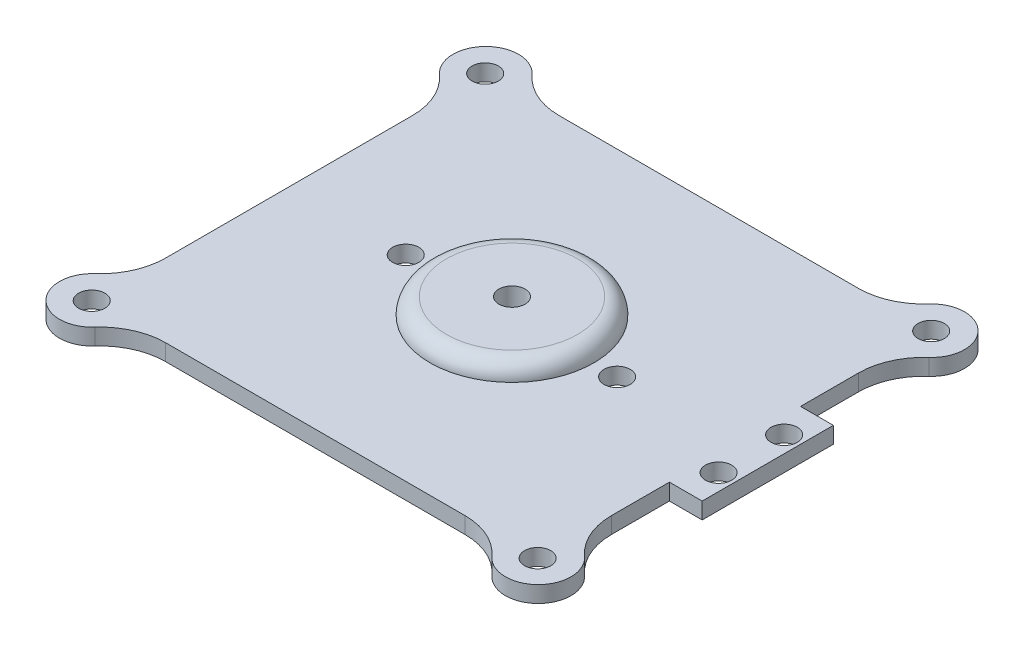
ISO-10303-21;
HEADER;
FILE_DESCRIPTION(('STEP AP214'),'2;1');
FILE_NAME('part.step','',(''),(''),'','','');
FILE_SCHEMA(('AUTOMOTIVE_DESIGN { 1 0 10303 214 1 1 1 1 }'));
ENDSEC;
DATA;
#1=APPLICATION_CONTEXT('core data for automotive mechanical design processes');
#2=APPLICATION_PROTOCOL_DEFINITION('international standard','automotive_design',2000,#1);
#3=PRODUCT_CONTEXT('',#1,'mechanical');
#4=PRODUCT('Part','Part','',(#3));
#5=PRODUCT_RELATED_PRODUCT_CATEGORY('part','',(#4));
#6=PRODUCT_DEFINITION_FORMATION('','',#4);
#7=PRODUCT_DEFINITION_CONTEXT('part definition',#1,'design');
#8=PRODUCT_DEFINITION('design','',#6,#7);
#9=PRODUCT_DEFINITION_SHAPE('','',#8);
#10=(LENGTH_UNIT() NAMED_UNIT(*) SI_UNIT(.MILLI.,.METRE.));
#11=(NAMED_UNIT(*) PLANE_ANGLE_UNIT() SI_UNIT($,.RADIAN.));
#12=(NAMED_UNIT(*) SI_UNIT($,.STERADIAN.) SOLID_ANGLE_UNIT());
#13=UNCERTAINTY_MEASURE_WITH_UNIT(LENGTH_MEASURE(1.E-05),#10,'distance_accuracy_value','');
#14=(GEOMETRIC_REPRESENTATION_CONTEXT(3) GLOBAL_UNCERTAINTY_ASSIGNED_CONTEXT((#13)) GLOBAL_UNIT_ASSIGNED_CONTEXT((#10,
#11,#12)) REPRESENTATION_CONTEXT('',''));
#15=CARTESIAN_POINT('',(0.,0.,0.));
#16=DIRECTION('',(0.,0.,1.));
#17=DIRECTION('',(1.,0.,0.));
#18=AXIS2_PLACEMENT_3D('',#15,#16,#17);
#19=CARTESIAN_POINT('',(-68.,5.,60.0000000000001));
#20=DIRECTION('',(0.,-1.,0.));
#21=DIRECTION('',(0.,0.,-1.));
#22=AXIS2_PLACEMENT_3D('',#19,#20,#21);
#23=PLANE('',#22);
#24=CARTESIAN_POINT('',(32.24,5.,0.171139926764999));
#25=DIRECTION('',(0.,1.,0.));
#26=DIRECTION('',(0.,0.,1.));
#27=AXIS2_PLACEMENT_3D('',#24,#25,#26);
#28=CIRCLE('',#27,4.00000000000001);
#29=CARTESIAN_POINT('',(32.24,5.,4.17113992676501));
#30=VERTEX_POINT('',#29);
#31=EDGE_CURVE('E340',#30,#30,#28,.T.);
#32=ORIENTED_EDGE('',*,*,#31,.F.);
#33=EDGE_LOOP('',(#32));
#34=FACE_BOUND('',#33,.T.);
#35=CARTESIAN_POINT('',(68.,5.,-59.828860073235));
#36=DIRECTION('',(0.,1.,0.));
#37=DIRECTION('',(0.,0.,1.));
#38=AXIS2_PLACEMENT_3D('',#35,#36,#37);
#39=CIRCLE('',#38,4.00000000000002);
#40=CARTESIAN_POINT('',(68.,5.,-55.828860073235));
#41=VERTEX_POINT('',#40);
#42=EDGE_CURVE('E333',#41,#41,#39,.T.);
#43=ORIENTED_EDGE('',*,*,#42,.F.);
#44=EDGE_LOOP('',(#43));
#45=FACE_BOUND('',#44,.T.);
#46=CARTESIAN_POINT('',(68.0000000000001,5.,60.171139926765));
#47=DIRECTION('',(0.,1.,0.));
#48=DIRECTION('',(0.,0.,1.));
#49=AXIS2_PLACEMENT_3D('',#46,#47,#48);
#50=CIRCLE('',#49,3.99999999999999);
#51=CARTESIAN_POINT('',(68.0000000000001,5.,64.171139926765));
#52=VERTEX_POINT('',#51);
#53=EDGE_CURVE('E352',#52,#52,#50,.T.);
#54=ORIENTED_EDGE('',*,*,#53,.F.);
#55=EDGE_LOOP('',(#54));
#56=FACE_BOUND('',#55,.T.);
#57=CARTESIAN_POINT('',(-68.,5.,-59.828860073235));
#58=DIRECTION('',(0.,1.,0.));
#59=DIRECTION('',(0.,0.,1.));
#60=AXIS2_PLACEMENT_3D('',#57,#58,#59);
#61=CIRCLE('',#60,4.00000000000002);
#62=CARTESIAN_POINT('',(-68.,5.,-55.828860073235));
#63=VERTEX_POINT('',#62);
#64=EDGE_CURVE('E345',#63,#63,#61,.T.);
#65=ORIENTED_EDGE('',*,*,#64,.F.);
#66=EDGE_LOOP('',(#65));
#67=FACE_BOUND('',#66,.T.);
#68=CARTESIAN_POINT('',(-32.24,5.,0.171139926764999));
#69=DIRECTION('',(0.,1.,0.));
#70=DIRECTION('',(0.,0.,1.));
#71=AXIS2_PLACEMENT_3D('',#68,#69,#70);
#72=CIRCLE('',#71,4.);
#73=CARTESIAN_POINT('',(-32.24,5.,4.171139926765));
#74=VERTEX_POINT('',#73);
#75=EDGE_CURVE('E327',#74,#74,#72,.T.);
#76=ORIENTED_EDGE('',*,*,#75,.F.);
#77=EDGE_LOOP('',(#76));
#78=FACE_BOUND('',#77,.T.);
#79=CARTESIAN_POINT('',(-68.,5.,60.171139926765));
#80=DIRECTION('',(0.,1.,0.));
#81=DIRECTION('',(0.,0.,1.));
#82=AXIS2_PLACEMENT_3D('',#79,#80,#81);
#83=CIRCLE('',#82,3.99999999999999);
#84=CARTESIAN_POINT('',(-68.,5.,64.171139926765));
#85=VERTEX_POINT('',#84);
#86=EDGE_CURVE('E357',#85,#85,#83,.T.);
#87=ORIENTED_EDGE('',*,*,#86,.F.);
#88=EDGE_LOOP('',(#87));
#89=FACE_BOUND('',#88,.T.);
#90=CARTESIAN_POINT('',(0.,5.,0.));
#91=DIRECTION('',(0.,1.,0.));
#92=DIRECTION('',(0.,0.,1.));
#93=AXIS2_PLACEMENT_3D('',#90,#91,#92);
#94=CIRCLE('',#93,25.);
#95=CARTESIAN_POINT('',(0.,5.,25.));
#96=VERTEX_POINT('',#95);
#97=EDGE_CURVE('E44',#96,#96,#94,.T.);
#98=ORIENTED_EDGE('',*,*,#97,.F.);
#99=EDGE_LOOP('',(#98));
#100=FACE_BOUND('',#99,.T.);
#101=CARTESIAN_POINT('',(73.,5.,9.99999999999999));
#102=DIRECTION('',(0.,1.,0.));
#103=DIRECTION('',(0.,0.,1.));
#104=AXIS2_PLACEMENT_3D('',#101,#102,#103);
#105=CIRCLE('',#104,3.99999999999999);
#106=CARTESIAN_POINT('',(73.,5.,14.));
#107=VERTEX_POINT('',#106);
#108=EDGE_CURVE('E553',#107,#107,#105,.T.);
#109=ORIENTED_EDGE('',*,*,#108,.F.);
#110=EDGE_LOOP('',(#109));
#111=FACE_BOUND('',#110,.T.);
#112=CARTESIAN_POINT('',(73.,5.,-10.));
#113=DIRECTION('',(0.,1.,0.));
#114=DIRECTION('',(0.,0.,1.));
#115=AXIS2_PLACEMENT_3D('',#112,#113,#114);
#116=CIRCLE('',#115,4.00000000000001);
#117=CARTESIAN_POINT('',(73.,5.,-6.00000000000001));
#118=VERTEX_POINT('',#117);
#119=EDGE_CURVE('E231',#118,#118,#116,.T.);
#120=ORIENTED_EDGE('',*,*,#119,.F.);
#121=EDGE_LOOP('',(#120));
#122=FACE_BOUND('',#121,.T.);
#123=CARTESIAN_POINT('',(88.,5.,-37.6393202250021));
#124=DIRECTION('',(0.,1.,0.));
#125=DIRECTION('',(0.,0.,1.));
#126=AXIS2_PLACEMENT_3D('',#123,#124,#125);
#127=CIRCLE('',#126,20.);
#128=CARTESIAN_POINT('',(74.6666666666667,5.,-52.5464400750007));
#129=VERTEX_POINT('',#128);
#130=CARTESIAN_POINT('',(68.,5.,-37.6393202250021));
#131=VERTEX_POINT('',#130);
#132=EDGE_CURVE('E234',#129,#131,#127,.T.);
#133=ORIENTED_EDGE('',*,*,#132,.F.);
#134=CARTESIAN_POINT('',(68.,5.,-60.));
#135=DIRECTION('',(0.,1.,0.));
#136=DIRECTION('',(0.,0.,1.));
#137=AXIS2_PLACEMENT_3D('',#134,#135,#136);
#138=CIRCLE('',#137,10.);
#139=CARTESIAN_POINT('',(60.5464400750007,5.,-66.6666666666667));
#140=VERTEX_POINT('',#139);
#141=EDGE_CURVE('E379',#129,#140,#138,.T.);
#142=ORIENTED_EDGE('',*,*,#141,.T.);
#143=CARTESIAN_POINT('',(45.6393202250021,5.,-80.));
#144=DIRECTION('',(0.,1.,0.));
#145=DIRECTION('',(0.,0.,1.));
#146=AXIS2_PLACEMENT_3D('',#143,#144,#145);
#147=CIRCLE('',#146,20.);
#148=CARTESIAN_POINT('',(45.6393202250021,5.,-60.));
#149=VERTEX_POINT('',#148);
#150=EDGE_CURVE('E310',#140,#149,#147,.F.);
#151=ORIENTED_EDGE('',*,*,#150,.T.);
#152=DIRECTION('',(-1.,0.,0.));
#153=VECTOR('',#152,1.);
#154=CARTESIAN_POINT('',(0.,5.,-60.));
#155=LINE('',#154,#153);
#156=CARTESIAN_POINT('',(-45.6393202250021,5.,-60.));
#157=VERTEX_POINT('',#156);
#158=EDGE_CURVE('E307',#149,#157,#155,.T.);
#159=ORIENTED_EDGE('',*,*,#158,.T.);
#160=CARTESIAN_POINT('',(-45.6393202250021,5.,-80.));
#161=DIRECTION('',(0.,1.,0.));
#162=DIRECTION('',(0.,0.,1.));
#163=AXIS2_PLACEMENT_3D('',#160,#161,#162);
#164=CIRCLE('',#163,20.);
#165=CARTESIAN_POINT('',(-60.5464400750007,5.,-66.6666666666667));
#166=VERTEX_POINT('',#165);
#167=EDGE_CURVE('E304',#166,#157,#164,.T.);
#168=ORIENTED_EDGE('',*,*,#167,.F.);
#169=CARTESIAN_POINT('',(-68.,5.,-60.));
#170=DIRECTION('',(0.,1.,0.));
#171=DIRECTION('',(0.,0.,-1.));
#172=AXIS2_PLACEMENT_3D('',#169,#170,#171);
#173=CIRCLE('',#172,10.);
#174=CARTESIAN_POINT('',(-74.6666666666667,5.,-52.5464400750007));
#175=VERTEX_POINT('',#174);
#176=EDGE_CURVE('E370',#166,#175,#173,.T.);
#177=ORIENTED_EDGE('',*,*,#176,.T.);
#178=CARTESIAN_POINT('',(-88.,5.,-37.6393202250021));
#179=DIRECTION('',(0.,1.,0.));
#180=DIRECTION('',(0.,0.,1.));
#181=AXIS2_PLACEMENT_3D('',#178,#179,#180);
#182=CIRCLE('',#181,20.);
#183=CARTESIAN_POINT('',(-68.,5.,-37.6393202250021));
#184=VERTEX_POINT('',#183);
#185=EDGE_CURVE('E283',#175,#184,#182,.F.);
#186=ORIENTED_EDGE('',*,*,#185,.T.);
#187=DIRECTION('',(0.,0.,1.));
#188=VECTOR('',#187,1.);
#189=CARTESIAN_POINT('',(-68.,5.,0.));
#190=LINE('',#189,#188);
#191=CARTESIAN_POINT('',(-68.,5.,37.6393202250021));
#192=VERTEX_POINT('',#191);
#193=EDGE_CURVE('E280',#184,#192,#190,.T.);
#194=ORIENTED_EDGE('',*,*,#193,.T.);
#195=CARTESIAN_POINT('',(-88.,5.,37.6393202250021));
#196=DIRECTION('',(0.,1.,0.));
#197=DIRECTION('',(0.,0.,1.));
#198=AXIS2_PLACEMENT_3D('',#195,#196,#197);
#199=CIRCLE('',#198,20.);
#200=CARTESIAN_POINT('',(-74.6666666666667,5.,52.5464400750007));
#201=VERTEX_POINT('',#200);
#202=EDGE_CURVE('E277',#192,#201,#199,.F.);
#203=ORIENTED_EDGE('',*,*,#202,.T.);
#204=CARTESIAN_POINT('',(-68.,5.,60.0000000000001));
#205=DIRECTION('',(0.,1.,0.));
#206=DIRECTION('',(0.,0.,-1.));
#207=AXIS2_PLACEMENT_3D('',#204,#205,#206);
#208=CIRCLE('',#207,10.);
#209=CARTESIAN_POINT('',(-60.5464400750008,5.,66.6666666666668));
#210=VERTEX_POINT('',#209);
#211=EDGE_CURVE('E371',#201,#210,#208,.T.);
#212=ORIENTED_EDGE('',*,*,#211,.T.);
#213=CARTESIAN_POINT('',(-45.6393202250023,5.,80.0000000000003));
#214=DIRECTION('',(0.,1.,0.));
#215=DIRECTION('',(0.,0.,1.));
#216=AXIS2_PLACEMENT_3D('',#213,#214,#215);
#217=CIRCLE('',#216,20.);
#218=CARTESIAN_POINT('',(-45.6393202250021,5.,60.0000000000003));
#219=VERTEX_POINT('',#218);
#220=EDGE_CURVE('E259',#219,#210,#217,.T.);
#221=ORIENTED_EDGE('',*,*,#220,.F.);
#222=DIRECTION('',(-1.,0.,0.));
#223=VECTOR('',#222,1.);
#224=CARTESIAN_POINT('',(-7.34341734071485E-13,5.,60.0000000000008));
#225=LINE('',#224,#223);
#226=CARTESIAN_POINT('',(45.6393202250036,5.,60.0000000000014));
#227=VERTEX_POINT('',#226);
#228=EDGE_CURVE('E256',#227,#219,#225,.T.);
#229=ORIENTED_EDGE('',*,*,#228,.F.);
#230=CARTESIAN_POINT('',(45.6393202250033,5.,80.0000000000014));
#231=DIRECTION('',(0.,1.,0.));
#232=DIRECTION('',(0.,0.,1.));
#233=AXIS2_PLACEMENT_3D('',#230,#231,#232);
#234=CIRCLE('',#233,20.);
#235=CARTESIAN_POINT('',(60.5464400750011,5.,66.6666666666672));
#236=VERTEX_POINT('',#235);
#237=EDGE_CURVE('E253',#227,#236,#234,.F.);
#238=ORIENTED_EDGE('',*,*,#237,.T.);
#239=CARTESIAN_POINT('',(68.,5.,60.));
#240=DIRECTION('',(0.,1.,0.));
#241=DIRECTION('',(0.,0.,1.));
#242=AXIS2_PLACEMENT_3D('',#239,#240,#241);
#243=CIRCLE('',#242,10.);
#244=CARTESIAN_POINT('',(74.6666666666667,5.,52.5464400750007));
#245=VERTEX_POINT('',#244);
#246=EDGE_CURVE('E373',#236,#245,#243,.T.);
#247=ORIENTED_EDGE('',*,*,#246,.T.);
#248=CARTESIAN_POINT('',(88.,5.,37.6393202250021));
#249=DIRECTION('',(0.,1.,0.));
#250=DIRECTION('',(0.,0.,1.));
#251=AXIS2_PLACEMENT_3D('',#248,#249,#250);
#252=CIRCLE('',#251,20.);
#253=CARTESIAN_POINT('',(68.,5.,37.6393202250021));
#254=VERTEX_POINT('',#253);
#255=EDGE_CURVE('E195',#245,#254,#252,.F.);
#256=ORIENTED_EDGE('',*,*,#255,.T.);
#257=DIRECTION('',(0.,0.,1.));
#258=VECTOR('',#257,1.);
#259=CARTESIAN_POINT('',(68.,5.,0.));
#260=LINE('',#259,#258);
#261=CARTESIAN_POINT('',(68.,5.,20.));
#262=VERTEX_POINT('',#261);
#263=EDGE_CURVE('E197',#262,#254,#260,.T.);
#264=ORIENTED_EDGE('',*,*,#263,.F.);
#265=DIRECTION('',(-1.,0.,0.));
#266=VECTOR('',#265,1.);
#267=CARTESIAN_POINT('',(0.,5.,20.));
#268=LINE('',#267,#266);
#269=CARTESIAN_POINT('',(78.,5.,20.));
#270=VERTEX_POINT('',#269);
#271=EDGE_CURVE('E216',#270,#262,#268,.T.);
#272=ORIENTED_EDGE('',*,*,#271,.F.);
#273=DIRECTION('',(0.,0.,-1.));
#274=VECTOR('',#273,1.);
#275=CARTESIAN_POINT('',(78.,5.,-60.));
#276=LINE('',#275,#274);
#277=CARTESIAN_POINT('',(78.,5.,-20.));
#278=VERTEX_POINT('',#277);
#279=EDGE_CURVE('E376',#270,#278,#276,.T.);
#280=ORIENTED_EDGE('',*,*,#279,.T.);
#281=DIRECTION('',(1.,0.,0.));
#282=VECTOR('',#281,1.);
#283=CARTESIAN_POINT('',(0.,5.,-20.));
#284=LINE('',#283,#282);
#285=CARTESIAN_POINT('',(68.,5.,-20.));
#286=VERTEX_POINT('',#285);
#287=EDGE_CURVE('E239',#286,#278,#284,.T.);
#288=ORIENTED_EDGE('',*,*,#287,.F.);
#289=DIRECTION('',(0.,0.,1.));
#290=VECTOR('',#289,1.);
#291=CARTESIAN_POINT('',(68.,5.,0.));
#292=LINE('',#291,#290);
#293=EDGE_CURVE('E236',#131,#286,#292,.T.);
#294=ORIENTED_EDGE('',*,*,#293,.F.);
#295=EDGE_LOOP('',(#133,#142,#151,#159,#168,#177,#186,#194,#203,#212,#221,#229,#238,#247,#256,
#264,#272,#280,#288,#294));
#296=FACE_BOUND('',#295,.T.);
#297=ADVANCED_FACE('F36',(#34,#45,#56,#67,#78,#89,#100,#111,#122,#296),#23,.F.);
#298=CARTESIAN_POINT('',(-68.,0.,60.0000000000001));
#299=DIRECTION('',(0.,-1.,0.));
#300=DIRECTION('',(0.,0.,-1.));
#301=AXIS2_PLACEMENT_3D('',#298,#299,#300);
#302=PLANE('',#301);
#303=CARTESIAN_POINT('',(73.,0.,-10.));
#304=DIRECTION('',(0.,-1.,0.));
#305=DIRECTION('',(0.,0.,-1.));
#306=AXIS2_PLACEMENT_3D('',#303,#304,#305);
#307=CIRCLE('',#306,4.00000000000001);
#308=CARTESIAN_POINT('',(73.,0.,-14.));
#309=VERTEX_POINT('',#308);
#310=EDGE_CURVE('E557',#309,#309,#307,.F.);
#311=ORIENTED_EDGE('',*,*,#310,.T.);
#312=EDGE_LOOP('',(#311));
#313=FACE_BOUND('',#312,.T.);
#314=CARTESIAN_POINT('',(73.,0.,9.99999999999999));
#315=DIRECTION('',(0.,-1.,0.));
#316=DIRECTION('',(0.,0.,-1.));
#317=AXIS2_PLACEMENT_3D('',#314,#315,#316);
#318=CIRCLE('',#317,3.99999999999999);
#319=CARTESIAN_POINT('',(73.,0.,5.99999999999999));
#320=VERTEX_POINT('',#319);
#321=EDGE_CURVE('E211',#320,#320,#318,.F.);
#322=ORIENTED_EDGE('',*,*,#321,.T.);
#323=EDGE_LOOP('',(#322));
#324=FACE_BOUND('',#323,.T.);
#325=CARTESIAN_POINT('',(32.24,0.,0.171139926764999));
#326=DIRECTION('',(0.,-1.,0.));
#327=DIRECTION('',(0.,0.,-1.));
#328=AXIS2_PLACEMENT_3D('',#325,#326,#327);
#329=CIRCLE('',#328,4.00000000000001);
#330=CARTESIAN_POINT('',(32.24,0.,-3.82886007323501));
#331=VERTEX_POINT('',#330);
#332=EDGE_CURVE('E330',#331,#331,#329,.F.);
#333=ORIENTED_EDGE('',*,*,#332,.T.);
#334=EDGE_LOOP('',(#333));
#335=FACE_BOUND('',#334,.T.);
#336=CARTESIAN_POINT('',(68.,0.,-59.828860073235));
#337=DIRECTION('',(0.,-1.,0.));
#338=DIRECTION('',(0.,0.,-1.));
#339=AXIS2_PLACEMENT_3D('',#336,#337,#338);
#340=CIRCLE('',#339,4.00000000000002);
#341=CARTESIAN_POINT('',(68.,0.,-63.8288600732351));
#342=VERTEX_POINT('',#341);
#343=EDGE_CURVE('E337',#342,#342,#340,.F.);
#344=ORIENTED_EDGE('',*,*,#343,.T.);
#345=EDGE_LOOP('',(#344));
#346=FACE_BOUND('',#345,.T.);
#347=CARTESIAN_POINT('',(68.0000000000001,0.,60.171139926765));
#348=DIRECTION('',(0.,-1.,0.));
#349=DIRECTION('',(0.,0.,-1.));
#350=AXIS2_PLACEMENT_3D('',#347,#348,#349);
#351=CIRCLE('',#350,3.99999999999999);
#352=CARTESIAN_POINT('',(68.0000000000001,0.,56.171139926765));
#353=VERTEX_POINT('',#352);
#354=EDGE_CURVE('E336',#353,#353,#351,.F.);
#355=ORIENTED_EDGE('',*,*,#354,.T.);
#356=EDGE_LOOP('',(#355));
#357=FACE_BOUND('',#356,.T.);
#358=CARTESIAN_POINT('',(-68.,0.,-59.828860073235));
#359=DIRECTION('',(0.,-1.,0.));
#360=DIRECTION('',(0.,0.,-1.));
#361=AXIS2_PLACEMENT_3D('',#358,#359,#360);
#362=CIRCLE('',#361,4.00000000000002);
#363=CARTESIAN_POINT('',(-68.,0.,-63.8288600732351));
#364=VERTEX_POINT('',#363);
#365=EDGE_CURVE('E349',#364,#364,#362,.F.);
#366=ORIENTED_EDGE('',*,*,#365,.T.);
#367=EDGE_LOOP('',(#366));
#368=FACE_BOUND('',#367,.T.);
#369=CARTESIAN_POINT('',(-32.24,0.,0.171139926764999));
#370=DIRECTION('',(0.,-1.,0.));
#371=DIRECTION('',(0.,0.,-1.));
#372=AXIS2_PLACEMENT_3D('',#369,#370,#371);
#373=CIRCLE('',#372,4.);
#374=CARTESIAN_POINT('',(-32.24,0.,-3.828860073235));
#375=VERTEX_POINT('',#374);
#376=EDGE_CURVE('E326',#375,#375,#373,.F.);
#377=ORIENTED_EDGE('',*,*,#376,.T.);
#378=EDGE_LOOP('',(#377));
#379=FACE_BOUND('',#378,.T.);
#380=CARTESIAN_POINT('',(-68.,0.,60.171139926765));
#381=DIRECTION('',(0.,-1.,0.));
#382=DIRECTION('',(0.,0.,-1.));
#383=AXIS2_PLACEMENT_3D('',#380,#381,#382);
#384=CIRCLE('',#383,3.99999999999999);
#385=CARTESIAN_POINT('',(-68.,0.,56.171139926765));
#386=VERTEX_POINT('',#385);
#387=EDGE_CURVE('E348',#386,#386,#384,.F.);
#388=ORIENTED_EDGE('',*,*,#387,.T.);
#389=EDGE_LOOP('',(#388));
#390=FACE_BOUND('',#389,.T.);
#391=CARTESIAN_POINT('',(0.,0.,0.));
#392=DIRECTION('',(0.,-1.,0.));
#393=DIRECTION('',(0.,0.,-1.));
#394=AXIS2_PLACEMENT_3D('',#391,#392,#393);
#395=CIRCLE('',#394,4.);
#396=CARTESIAN_POINT('',(0.,0.,-4.));
#397=VERTEX_POINT('',#396);
#398=EDGE_CURVE('E360',#397,#397,#395,.F.);
#399=ORIENTED_EDGE('',*,*,#398,.T.);
#400=EDGE_LOOP('',(#399));
#401=FACE_BOUND('',#400,.T.);
#402=CARTESIAN_POINT('',(68.,0.,-60.));
#403=DIRECTION('',(0.,1.,0.));
#404=DIRECTION('',(0.,0.,1.));
#405=AXIS2_PLACEMENT_3D('',#402,#403,#404);
#406=CIRCLE('',#405,10.);
#407=CARTESIAN_POINT('',(74.6666666666667,0.,-52.5464400750007));
#408=VERTEX_POINT('',#407);
#409=CARTESIAN_POINT('',(60.5464400750007,0.,-66.6666666666667));
#410=VERTEX_POINT('',#409);
#411=EDGE_CURVE('E385',#408,#410,#406,.T.);
#412=ORIENTED_EDGE('',*,*,#411,.F.);
#413=CARTESIAN_POINT('',(88.,0.,-37.6393202250021));
#414=DIRECTION('',(0.,-1.,0.));
#415=DIRECTION('',(0.,0.,-1.));
#416=AXIS2_PLACEMENT_3D('',#413,#414,#415);
#417=CIRCLE('',#416,20.);
#418=CARTESIAN_POINT('',(68.,0.,-37.6393202250021));
#419=VERTEX_POINT('',#418);
#420=EDGE_CURVE('E203',#408,#419,#417,.F.);
#421=ORIENTED_EDGE('',*,*,#420,.T.);
#422=DIRECTION('',(0.,0.,1.));
#423=VECTOR('',#422,1.);
#424=CARTESIAN_POINT('',(68.,0.,0.));
#425=LINE('',#424,#423);
#426=CARTESIAN_POINT('',(68.,0.,-20.));
#427=VERTEX_POINT('',#426);
#428=EDGE_CURVE('E227',#419,#427,#425,.T.);
#429=ORIENTED_EDGE('',*,*,#428,.T.);
#430=DIRECTION('',(1.,0.,0.));
#431=VECTOR('',#430,1.);
#432=CARTESIAN_POINT('',(0.,0.,-20.));
#433=LINE('',#432,#431);
#434=CARTESIAN_POINT('',(78.,0.,-20.));
#435=VERTEX_POINT('',#434);
#436=EDGE_CURVE('E230',#427,#435,#433,.T.);
#437=ORIENTED_EDGE('',*,*,#436,.T.);
#438=DIRECTION('',(0.,0.,-1.));
#439=VECTOR('',#438,1.);
#440=CARTESIAN_POINT('',(78.,0.,-60.));
#441=LINE('',#440,#439);
#442=CARTESIAN_POINT('',(78.,0.,20.));
#443=VERTEX_POINT('',#442);
#444=EDGE_CURVE('E186',#443,#435,#441,.T.);
#445=ORIENTED_EDGE('',*,*,#444,.F.);
#446=DIRECTION('',(-1.,0.,0.));
#447=VECTOR('',#446,1.);
#448=CARTESIAN_POINT('',(0.,0.,20.));
#449=LINE('',#448,#447);
#450=CARTESIAN_POINT('',(68.,0.,20.));
#451=VERTEX_POINT('',#450);
#452=EDGE_CURVE('E205',#443,#451,#449,.T.);
#453=ORIENTED_EDGE('',*,*,#452,.T.);
#454=DIRECTION('',(0.,0.,1.));
#455=VECTOR('',#454,1.);
#456=CARTESIAN_POINT('',(68.,0.,0.));
#457=LINE('',#456,#455);
#458=CARTESIAN_POINT('',(68.,0.,37.6393202250021));
#459=VERTEX_POINT('',#458);
#460=EDGE_CURVE('E202',#451,#459,#457,.T.);
#461=ORIENTED_EDGE('',*,*,#460,.T.);
#462=CARTESIAN_POINT('',(88.,0.,37.6393202250021));
#463=DIRECTION('',(0.,-1.,0.));
#464=DIRECTION('',(0.,0.,-1.));
#465=AXIS2_PLACEMENT_3D('',#462,#463,#464);
#466=CIRCLE('',#465,20.);
#467=CARTESIAN_POINT('',(74.6666666666667,0.,52.5464400750007));
#468=VERTEX_POINT('',#467);
#469=EDGE_CURVE('E192',#468,#459,#466,.T.);
#470=ORIENTED_EDGE('',*,*,#469,.F.);
#471=CARTESIAN_POINT('',(68.,0.,60.));
#472=DIRECTION('',(0.,1.,0.));
#473=DIRECTION('',(0.,0.,1.));
#474=AXIS2_PLACEMENT_3D('',#471,#472,#473);
#475=CIRCLE('',#474,10.);
#476=CARTESIAN_POINT('',(60.5464400750011,0.,66.6666666666672));
#477=VERTEX_POINT('',#476);
#478=EDGE_CURVE('E175',#477,#468,#475,.T.);
#479=ORIENTED_EDGE('',*,*,#478,.F.);
#480=CARTESIAN_POINT('',(45.6393202250033,0.,80.0000000000014));
#481=DIRECTION('',(0.,-1.,0.));
#482=DIRECTION('',(0.,0.,-1.));
#483=AXIS2_PLACEMENT_3D('',#480,#481,#482);
#484=CIRCLE('',#483,20.);
#485=CARTESIAN_POINT('',(45.6393202250036,0.,60.0000000000014));
#486=VERTEX_POINT('',#485);
#487=EDGE_CURVE('E251',#486,#477,#484,.T.);
#488=ORIENTED_EDGE('',*,*,#487,.F.);
#489=DIRECTION('',(-1.,0.,0.));
#490=VECTOR('',#489,1.);
#491=CARTESIAN_POINT('',(-7.34341734071485E-13,0.,60.0000000000008));
#492=LINE('',#491,#490);
#493=CARTESIAN_POINT('',(-45.6393202250021,0.,60.0000000000003));
#494=VERTEX_POINT('',#493);
#495=EDGE_CURVE('E264',#486,#494,#492,.T.);
#496=ORIENTED_EDGE('',*,*,#495,.T.);
#497=CARTESIAN_POINT('',(-45.6393202250023,0.,80.0000000000003));
#498=DIRECTION('',(0.,-1.,0.));
#499=DIRECTION('',(0.,0.,-1.));
#500=AXIS2_PLACEMENT_3D('',#497,#498,#499);
#501=CIRCLE('',#500,20.);
#502=CARTESIAN_POINT('',(-60.5464400750008,0.,66.6666666666668));
#503=VERTEX_POINT('',#502);
#504=EDGE_CURVE('E223',#494,#503,#501,.F.);
#505=ORIENTED_EDGE('',*,*,#504,.T.);
#506=CARTESIAN_POINT('',(-68.,0.,60.0000000000001));
#507=DIRECTION('',(0.,1.,0.));
#508=DIRECTION('',(0.,0.,-1.));
#509=AXIS2_PLACEMENT_3D('',#506,#507,#508);
#510=CIRCLE('',#509,10.);
#511=CARTESIAN_POINT('',(-74.6666666666667,0.,52.5464400750007));
#512=VERTEX_POINT('',#511);
#513=EDGE_CURVE('E187',#512,#503,#510,.T.);
#514=ORIENTED_EDGE('',*,*,#513,.F.);
#515=CARTESIAN_POINT('',(-88.,0.,37.6393202250021));
#516=DIRECTION('',(0.,-1.,0.));
#517=DIRECTION('',(0.,0.,-1.));
#518=AXIS2_PLACEMENT_3D('',#515,#516,#517);
#519=CIRCLE('',#518,20.);
#520=CARTESIAN_POINT('',(-68.,0.,37.6393202250021));
#521=VERTEX_POINT('',#520);
#522=EDGE_CURVE('E274',#521,#512,#519,.T.);
#523=ORIENTED_EDGE('',*,*,#522,.F.);
#524=DIRECTION('',(0.,0.,1.));
#525=VECTOR('',#524,1.);
#526=CARTESIAN_POINT('',(-68.,0.,0.));
#527=LINE('',#526,#525);
#528=CARTESIAN_POINT('',(-68.,0.,-37.6393202250021));
#529=VERTEX_POINT('',#528);
#530=EDGE_CURVE('E290',#529,#521,#527,.T.);
#531=ORIENTED_EDGE('',*,*,#530,.F.);
#532=CARTESIAN_POINT('',(-88.,0.,-37.6393202250021));
#533=DIRECTION('',(0.,-1.,0.));
#534=DIRECTION('',(0.,0.,-1.));
#535=AXIS2_PLACEMENT_3D('',#532,#533,#534);
#536=CIRCLE('',#535,20.);
#537=CARTESIAN_POINT('',(-74.6666666666667,0.,-52.5464400750007));
#538=VERTEX_POINT('',#537);
#539=EDGE_CURVE('E59',#538,#529,#536,.T.);
#540=ORIENTED_EDGE('',*,*,#539,.F.);
#541=CARTESIAN_POINT('',(-68.,0.,-60.));
#542=DIRECTION('',(0.,1.,0.));
#543=DIRECTION('',(0.,0.,-1.));
#544=AXIS2_PLACEMENT_3D('',#541,#542,#543);
#545=CIRCLE('',#544,10.);
#546=CARTESIAN_POINT('',(-60.5464400750007,0.,-66.6666666666667));
#547=VERTEX_POINT('',#546);
#548=EDGE_CURVE('E374',#547,#538,#545,.T.);
#549=ORIENTED_EDGE('',*,*,#548,.F.);
#550=CARTESIAN_POINT('',(-45.6393202250021,0.,-80.));
#551=DIRECTION('',(0.,-1.,0.));
#552=DIRECTION('',(0.,0.,-1.));
#553=AXIS2_PLACEMENT_3D('',#550,#551,#552);
#554=CIRCLE('',#553,20.);
#555=CARTESIAN_POINT('',(-45.6393202250021,0.,-60.));
#556=VERTEX_POINT('',#555);
#557=EDGE_CURVE('E317',#547,#556,#554,.F.);
#558=ORIENTED_EDGE('',*,*,#557,.T.);
#559=DIRECTION('',(-1.,0.,0.));
#560=VECTOR('',#559,1.);
#561=CARTESIAN_POINT('',(0.,0.,-60.));
#562=LINE('',#561,#560);
#563=CARTESIAN_POINT('',(45.6393202250021,0.,-60.));
#564=VERTEX_POINT('',#563);
#565=EDGE_CURVE('E299',#564,#556,#562,.T.);
#566=ORIENTED_EDGE('',*,*,#565,.F.);
#567=CARTESIAN_POINT('',(45.6393202250021,0.,-80.));
#568=DIRECTION('',(0.,-1.,0.));
#569=DIRECTION('',(0.,0.,-1.));
#570=AXIS2_PLACEMENT_3D('',#567,#568,#569);
#571=CIRCLE('',#570,20.);
#572=EDGE_CURVE('E302',#410,#564,#571,.T.);
#573=ORIENTED_EDGE('',*,*,#572,.F.);
#574=EDGE_LOOP('',(#412,#421,#429,#437,#445,#453,#461,#470,#479,#488,#496,#505,#514,#523,#531,
#540,#549,#558,#566,#573));
#575=FACE_BOUND('',#574,.T.);
#576=ADVANCED_FACE('F199',(#313,#324,#335,#346,#357,#368,#379,#390,#401,#575),#302,.T.);
#577=CARTESIAN_POINT('',(-68.,5.,60.0000000000001));
#578=DIRECTION('',(0.,-1.,0.));
#579=DIRECTION('',(0.,0.,-1.));
#580=AXIS2_PLACEMENT_3D('',#577,#578,#579);
#581=CYLINDRICAL_SURFACE('',#580,10.);
#582=ORIENTED_EDGE('',*,*,#513,.T.);
#583=DIRECTION('',(0.,1.,0.));
#584=VECTOR('',#583,1.);
#585=CARTESIAN_POINT('',(-60.5464400750008,-0.00100000000000013,66.6666666666668));
#586=LINE('',#585,#584);
#587=EDGE_CURVE('E265',#503,#210,#586,.T.);
#588=ORIENTED_EDGE('',*,*,#587,.T.);
#589=ORIENTED_EDGE('',*,*,#211,.F.);
#590=DIRECTION('',(0.,1.,0.));
#591=VECTOR('',#590,1.);
#592=CARTESIAN_POINT('',(-74.6666666666667,-0.00100000000000013,52.5464400750007));
#593=LINE('',#592,#591);
#594=EDGE_CURVE('E287',#512,#201,#593,.T.);
#595=ORIENTED_EDGE('',*,*,#594,.F.);
#596=EDGE_LOOP('',(#582,#588,#589,#595));
#597=FACE_BOUND('',#596,.T.);
#598=ADVANCED_FACE('F450',(#597),#581,.T.);
#599=CARTESIAN_POINT('',(68.,5.,60.));
#600=DIRECTION('',(0.,-1.,0.));
#601=DIRECTION('',(0.,0.,-1.));
#602=AXIS2_PLACEMENT_3D('',#599,#600,#601);
#603=CYLINDRICAL_SURFACE('',#602,10.);
#604=ORIENTED_EDGE('',*,*,#478,.T.);
#605=DIRECTION('',(0.,1.,0.));
#606=VECTOR('',#605,1.);
#607=CARTESIAN_POINT('',(74.6666666666667,-0.00100000000000013,52.5464400750007));
#608=LINE('',#607,#606);
#609=EDGE_CURVE('E178',#468,#245,#608,.T.);
#610=ORIENTED_EDGE('',*,*,#609,.T.);
#611=ORIENTED_EDGE('',*,*,#246,.F.);
#612=DIRECTION('',(0.,1.,0.));
#613=VECTOR('',#612,1.);
#614=CARTESIAN_POINT('',(60.5464400750011,-0.00100000000000013,66.6666666666672));
#615=LINE('',#614,#613);
#616=EDGE_CURVE('E181',#477,#236,#615,.T.);
#617=ORIENTED_EDGE('',*,*,#616,.F.);
#618=EDGE_LOOP('',(#604,#610,#611,#617));
#619=FACE_BOUND('',#618,.T.);
#620=ADVANCED_FACE('F177',(#619),#603,.T.);
#621=CARTESIAN_POINT('',(78.,5.,-60.));
#622=DIRECTION('',(-1.,0.,0.));
#623=DIRECTION('',(0.,0.,1.));
#624=AXIS2_PLACEMENT_3D('',#621,#622,#623);
#625=PLANE('',#624);
#626=ORIENTED_EDGE('',*,*,#444,.T.);
#627=DIRECTION('',(0.,1.,0.));
#628=VECTOR('',#627,1.);
#629=CARTESIAN_POINT('',(78.,-0.00100000000000013,-20.));
#630=LINE('',#629,#628);
#631=EDGE_CURVE('E208',#435,#278,#630,.T.);
#632=ORIENTED_EDGE('',*,*,#631,.T.);
#633=ORIENTED_EDGE('',*,*,#279,.F.);
#634=DIRECTION('',(0.,1.,0.));
#635=VECTOR('',#634,1.);
#636=CARTESIAN_POINT('',(78.,-0.00100000000000013,20.));
#637=LINE('',#636,#635);
#638=EDGE_CURVE('E196',#443,#270,#637,.T.);
#639=ORIENTED_EDGE('',*,*,#638,.F.);
#640=EDGE_LOOP('',(#626,#632,#633,#639));
#641=FACE_BOUND('',#640,.T.);
#642=ADVANCED_FACE('F426',(#641),#625,.F.);
#643=CARTESIAN_POINT('',(68.,5.,-60.));
#644=DIRECTION('',(0.,-1.,0.));
#645=DIRECTION('',(0.,0.,-1.));
#646=AXIS2_PLACEMENT_3D('',#643,#644,#645);
#647=CYLINDRICAL_SURFACE('',#646,10.);
#648=ORIENTED_EDGE('',*,*,#411,.T.);
#649=DIRECTION('',(0.,1.,0.));
#650=VECTOR('',#649,1.);
#651=CARTESIAN_POINT('',(60.5464400750007,-0.00100000000000013,-66.6666666666667));
#652=LINE('',#651,#650);
#653=EDGE_CURVE('E314',#410,#140,#652,.T.);
#654=ORIENTED_EDGE('',*,*,#653,.T.);
#655=ORIENTED_EDGE('',*,*,#141,.F.);
#656=DIRECTION('',(0.,1.,0.));
#657=VECTOR('',#656,1.);
#658=CARTESIAN_POINT('',(74.6666666666667,-0.00100000000000013,-52.5464400750007));
#659=LINE('',#658,#657);
#660=EDGE_CURVE('E241',#408,#129,#659,.T.);
#661=ORIENTED_EDGE('',*,*,#660,.F.);
#662=EDGE_LOOP('',(#648,#654,#655,#661));
#663=FACE_BOUND('',#662,.T.);
#664=ADVANCED_FACE('F414',(#663),#647,.T.);
#665=CARTESIAN_POINT('',(-68.,5.,-60.));
#666=DIRECTION('',(0.,-1.,0.));
#667=DIRECTION('',(0.,0.,-1.));
#668=AXIS2_PLACEMENT_3D('',#665,#666,#667);
#669=CYLINDRICAL_SURFACE('',#668,10.);
#670=ORIENTED_EDGE('',*,*,#548,.T.);
#671=DIRECTION('',(0.,1.,0.));
#672=VECTOR('',#671,1.);
#673=CARTESIAN_POINT('',(-74.6666666666667,-0.00100000000000013,-52.5464400750007));
#674=LINE('',#673,#672);
#675=EDGE_CURVE('E291',#538,#175,#674,.T.);
#676=ORIENTED_EDGE('',*,*,#675,.T.);
#677=ORIENTED_EDGE('',*,*,#176,.F.);
#678=DIRECTION('',(0.,1.,0.));
#679=VECTOR('',#678,1.);
#680=CARTESIAN_POINT('',(-60.5464400750007,-0.00100000000000013,-66.6666666666667));
#681=LINE('',#680,#679);
#682=EDGE_CURVE('E313',#547,#166,#681,.T.);
#683=ORIENTED_EDGE('',*,*,#682,.F.);
#684=EDGE_LOOP('',(#670,#676,#677,#683));
#685=FACE_BOUND('',#684,.T.);
#686=ADVANCED_FACE('F388',(#685),#669,.T.);
#687=CARTESIAN_POINT('',(0.,10.,0.));
#688=DIRECTION('',(0.,1.,0.));
#689=DIRECTION('',(0.,0.,1.));
#690=AXIS2_PLACEMENT_3D('',#687,#688,#689);
#691=PLANE('',#690);
#692=CARTESIAN_POINT('',(0.,10.,0.));
#693=DIRECTION('',(0.,1.,0.));
#694=DIRECTION('',(0.,0.,1.));
#695=AXIS2_PLACEMENT_3D('',#692,#693,#694);
#696=CIRCLE('',#695,20.);
#697=CARTESIAN_POINT('',(0.,10.,20.));
#698=VERTEX_POINT('',#697);
#699=EDGE_CURVE('E11',#698,#698,#696,.T.);
#700=ORIENTED_EDGE('',*,*,#699,.T.);
#701=EDGE_LOOP('',(#700));
#702=FACE_BOUND('',#701,.T.);
#703=CARTESIAN_POINT('',(0.,10.,0.));
#704=DIRECTION('',(0.,1.,0.));
#705=DIRECTION('',(0.,0.,1.));
#706=AXIS2_PLACEMENT_3D('',#703,#704,#705);
#707=CIRCLE('',#706,4.);
#708=CARTESIAN_POINT('',(0.,10.,4.));
#709=VERTEX_POINT('',#708);
#710=EDGE_CURVE('E363',#709,#709,#707,.T.);
#711=ORIENTED_EDGE('',*,*,#710,.F.);
#712=EDGE_LOOP('',(#711));
#713=FACE_BOUND('',#712,.T.);
#714=ADVANCED_FACE('F456',(#702,#713),#691,.T.);
#715=CARTESIAN_POINT('',(0.,-0.000999999999999265,0.));
#716=DIRECTION('',(0.,1.,0.));
#717=DIRECTION('',(0.,0.,1.));
#718=AXIS2_PLACEMENT_3D('',#715,#716,#717);
#719=CYLINDRICAL_SURFACE('',#718,4.);
#720=ORIENTED_EDGE('',*,*,#398,.F.);
#721=EDGE_LOOP('',(#720));
#722=FACE_BOUND('',#721,.T.);
#723=ORIENTED_EDGE('',*,*,#710,.T.);
#724=EDGE_LOOP('',(#723));
#725=FACE_BOUND('',#724,.T.);
#726=ADVANCED_FACE('F524',(#722,#725),#719,.F.);
#727=CARTESIAN_POINT('',(-68.,-0.00100000000000013,60.171139926765));
#728=DIRECTION('',(0.,1.,0.));
#729=DIRECTION('',(0.,0.,1.));
#730=AXIS2_PLACEMENT_3D('',#727,#728,#729);
#731=CYLINDRICAL_SURFACE('',#730,3.99999999999999);
#732=ORIENTED_EDGE('',*,*,#387,.F.);
#733=EDGE_LOOP('',(#732));
#734=FACE_BOUND('',#733,.T.);
#735=ORIENTED_EDGE('',*,*,#86,.T.);
#736=EDGE_LOOP('',(#735));
#737=FACE_BOUND('',#736,.T.);
#738=ADVANCED_FACE('F507',(#734,#737),#731,.F.);
#739=CARTESIAN_POINT('',(-32.24,-0.00100000000000013,0.171139926764999));
#740=DIRECTION('',(0.,1.,0.));
#741=DIRECTION('',(0.,0.,1.));
#742=AXIS2_PLACEMENT_3D('',#739,#740,#741);
#743=CYLINDRICAL_SURFACE('',#742,4.);
#744=ORIENTED_EDGE('',*,*,#376,.F.);
#745=EDGE_LOOP('',(#744));
#746=FACE_BOUND('',#745,.T.);
#747=ORIENTED_EDGE('',*,*,#75,.T.);
#748=EDGE_LOOP('',(#747));
#749=FACE_BOUND('',#748,.T.);
#750=ADVANCED_FACE('F503',(#746,#749),#743,.F.);
#751=CARTESIAN_POINT('',(-68.,-0.00100000000000013,-59.828860073235));
#752=DIRECTION('',(0.,1.,0.));
#753=DIRECTION('',(0.,0.,1.));
#754=AXIS2_PLACEMENT_3D('',#751,#752,#753);
#755=CYLINDRICAL_SURFACE('',#754,4.00000000000002);
#756=ORIENTED_EDGE('',*,*,#365,.F.);
#757=EDGE_LOOP('',(#756));
#758=FACE_BOUND('',#757,.T.);
#759=ORIENTED_EDGE('',*,*,#64,.T.);
#760=EDGE_LOOP('',(#759));
#761=FACE_BOUND('',#760,.T.);
#762=ADVANCED_FACE('F506',(#758,#761),#755,.F.);
#763=CARTESIAN_POINT('',(68.0000000000001,-0.00100000000000013,60.171139926765));
#764=DIRECTION('',(0.,1.,0.));
#765=DIRECTION('',(0.,0.,1.));
#766=AXIS2_PLACEMENT_3D('',#763,#764,#765);
#767=CYLINDRICAL_SURFACE('',#766,3.99999999999999);
#768=ORIENTED_EDGE('',*,*,#354,.F.);
#769=EDGE_LOOP('',(#768));
#770=FACE_BOUND('',#769,.T.);
#771=ORIENTED_EDGE('',*,*,#53,.T.);
#772=EDGE_LOOP('',(#771));
#773=FACE_BOUND('',#772,.T.);
#774=ADVANCED_FACE('F512',(#770,#773),#767,.F.);
#775=CARTESIAN_POINT('',(68.,-0.00100000000000013,-59.828860073235));
#776=DIRECTION('',(0.,1.,0.));
#777=DIRECTION('',(0.,0.,1.));
#778=AXIS2_PLACEMENT_3D('',#775,#776,#777);
#779=CYLINDRICAL_SURFACE('',#778,4.00000000000002);
#780=ORIENTED_EDGE('',*,*,#343,.F.);
#781=EDGE_LOOP('',(#780));
#782=FACE_BOUND('',#781,.T.);
#783=ORIENTED_EDGE('',*,*,#42,.T.);
#784=EDGE_LOOP('',(#783));
#785=FACE_BOUND('',#784,.T.);
#786=ADVANCED_FACE('F509',(#782,#785),#779,.F.);
#787=CARTESIAN_POINT('',(32.24,-0.00100000000000013,0.171139926764999));
#788=DIRECTION('',(0.,1.,0.));
#789=DIRECTION('',(0.,0.,1.));
#790=AXIS2_PLACEMENT_3D('',#787,#788,#789);
#791=CYLINDRICAL_SURFACE('',#790,4.00000000000001);
#792=ORIENTED_EDGE('',*,*,#332,.F.);
#793=EDGE_LOOP('',(#792));
#794=FACE_BOUND('',#793,.T.);
#795=ORIENTED_EDGE('',*,*,#31,.T.);
#796=EDGE_LOOP('',(#795));
#797=FACE_BOUND('',#796,.T.);
#798=ADVANCED_FACE('F497',(#794,#797),#791,.F.);
#799=CARTESIAN_POINT('',(45.6393202250021,-0.00100000000000013,-80.));
#800=DIRECTION('',(0.,1.,0.));
#801=DIRECTION('',(0.,0.,1.));
#802=AXIS2_PLACEMENT_3D('',#799,#800,#801);
#803=CYLINDRICAL_SURFACE('',#802,20.);
#804=ORIENTED_EDGE('',*,*,#572,.T.);
#805=DIRECTION('',(0.,1.,0.));
#806=VECTOR('',#805,1.);
#807=CARTESIAN_POINT('',(45.6393202250021,-0.00100000000000013,-60.));
#808=LINE('',#807,#806);
#809=EDGE_CURVE('E318',#564,#149,#808,.T.);
#810=ORIENTED_EDGE('',*,*,#809,.T.);
#811=ORIENTED_EDGE('',*,*,#150,.F.);
#812=ORIENTED_EDGE('',*,*,#653,.F.);
#813=EDGE_LOOP('',(#804,#810,#811,#812));
#814=FACE_BOUND('',#813,.T.);
#815=ADVANCED_FACE('F411',(#814),#803,.F.);
#816=CARTESIAN_POINT('',(0.,-0.00100000000000013,-60.));
#817=DIRECTION('',(0.,0.,-1.));
#818=DIRECTION('',(-1.,0.,0.));
#819=AXIS2_PLACEMENT_3D('',#816,#817,#818);
#820=PLANE('',#819);
#821=ORIENTED_EDGE('',*,*,#565,.T.);
#822=DIRECTION('',(0.,1.,0.));
#823=VECTOR('',#822,1.);
#824=CARTESIAN_POINT('',(-45.6393202250021,-0.00100000000000013,-60.));
#825=LINE('',#824,#823);
#826=EDGE_CURVE('E320',#556,#157,#825,.T.);
#827=ORIENTED_EDGE('',*,*,#826,.T.);
#828=ORIENTED_EDGE('',*,*,#158,.F.);
#829=ORIENTED_EDGE('',*,*,#809,.F.);
#830=EDGE_LOOP('',(#821,#827,#828,#829));
#831=FACE_BOUND('',#830,.T.);
#832=ADVANCED_FACE('F407',(#831),#820,.T.);
#833=CARTESIAN_POINT('',(-45.6393202250021,-0.00100000000000013,-80.));
#834=DIRECTION('',(0.,1.,0.));
#835=DIRECTION('',(0.,0.,1.));
#836=AXIS2_PLACEMENT_3D('',#833,#834,#835);
#837=CYLINDRICAL_SURFACE('',#836,20.);
#838=ORIENTED_EDGE('',*,*,#682,.T.);
#839=ORIENTED_EDGE('',*,*,#167,.T.);
#840=ORIENTED_EDGE('',*,*,#826,.F.);
#841=ORIENTED_EDGE('',*,*,#557,.F.);
#842=EDGE_LOOP('',(#838,#839,#840,#841));
#843=FACE_BOUND('',#842,.T.);
#844=ADVANCED_FACE('F402',(#843),#837,.F.);
#845=CARTESIAN_POINT('',(73.,-0.00100000000000013,9.99999999999999));
#846=DIRECTION('',(0.,1.,0.));
#847=DIRECTION('',(0.,0.,1.));
#848=AXIS2_PLACEMENT_3D('',#845,#846,#847);
#849=CYLINDRICAL_SURFACE('',#848,3.99999999999999);
#850=ORIENTED_EDGE('',*,*,#321,.F.);
#851=EDGE_LOOP('',(#850));
#852=FACE_BOUND('',#851,.T.);
#853=ORIENTED_EDGE('',*,*,#108,.T.);
#854=EDGE_LOOP('',(#853));
#855=FACE_BOUND('',#854,.T.);
#856=ADVANCED_FACE('F502',(#852,#855),#849,.F.);
#857=CARTESIAN_POINT('',(73.,-0.00100000000000013,-10.));
#858=DIRECTION('',(0.,1.,0.));
#859=DIRECTION('',(0.,0.,1.));
#860=AXIS2_PLACEMENT_3D('',#857,#858,#859);
#861=CYLINDRICAL_SURFACE('',#860,4.00000000000001);
#862=ORIENTED_EDGE('',*,*,#310,.F.);
#863=EDGE_LOOP('',(#862));
#864=FACE_BOUND('',#863,.T.);
#865=ORIENTED_EDGE('',*,*,#119,.T.);
#866=EDGE_LOOP('',(#865));
#867=FACE_BOUND('',#866,.T.);
#868=ADVANCED_FACE('F568',(#864,#867),#861,.F.);
#869=CARTESIAN_POINT('',(45.6393202250033,-0.00100000000000013,80.0000000000014));
#870=DIRECTION('',(0.,1.,0.));
#871=DIRECTION('',(0.,0.,1.));
#872=AXIS2_PLACEMENT_3D('',#869,#870,#871);
#873=CYLINDRICAL_SURFACE('',#872,20.);
#874=ORIENTED_EDGE('',*,*,#487,.T.);
#875=ORIENTED_EDGE('',*,*,#616,.T.);
#876=ORIENTED_EDGE('',*,*,#237,.F.);
#877=DIRECTION('',(0.,1.,0.));
#878=VECTOR('',#877,1.);
#879=CARTESIAN_POINT('',(45.6393202250036,-0.00100000000000013,60.0000000000014));
#880=LINE('',#879,#878);
#881=EDGE_CURVE('E262',#486,#227,#880,.T.);
#882=ORIENTED_EDGE('',*,*,#881,.F.);
#883=EDGE_LOOP('',(#874,#875,#876,#882));
#884=FACE_BOUND('',#883,.T.);
#885=ADVANCED_FACE('F481',(#884),#873,.F.);
#886=CARTESIAN_POINT('',(-45.6393202250023,-0.00100000000000013,80.0000000000003));
#887=DIRECTION('',(0.,1.,0.));
#888=DIRECTION('',(0.,0.,1.));
#889=AXIS2_PLACEMENT_3D('',#886,#887,#888);
#890=CYLINDRICAL_SURFACE('',#889,20.);
#891=DIRECTION('',(0.,1.,0.));
#892=VECTOR('',#891,1.);
#893=CARTESIAN_POINT('',(-45.6393202250021,-0.00100000000000013,60.0000000000003));
#894=LINE('',#893,#892);
#895=EDGE_CURVE('E268',#494,#219,#894,.T.);
#896=ORIENTED_EDGE('',*,*,#895,.T.);
#897=ORIENTED_EDGE('',*,*,#220,.T.);
#898=ORIENTED_EDGE('',*,*,#587,.F.);
#899=ORIENTED_EDGE('',*,*,#504,.F.);
#900=EDGE_LOOP('',(#896,#897,#898,#899));
#901=FACE_BOUND('',#900,.T.);
#902=ADVANCED_FACE('F474',(#901),#890,.F.);
#903=CARTESIAN_POINT('',(-7.34341734071485E-13,-0.00100000000000013,60.0000000000008));
#904=DIRECTION('',(0.,0.,-1.));
#905=DIRECTION('',(-1.,0.,0.));
#906=AXIS2_PLACEMENT_3D('',#903,#904,#905);
#907=PLANE('',#906);
#908=ORIENTED_EDGE('',*,*,#881,.T.);
#909=ORIENTED_EDGE('',*,*,#228,.T.);
#910=ORIENTED_EDGE('',*,*,#895,.F.);
#911=ORIENTED_EDGE('',*,*,#495,.F.);
#912=EDGE_LOOP('',(#908,#909,#910,#911));
#913=FACE_BOUND('',#912,.T.);
#914=ADVANCED_FACE('F478',(#913),#907,.F.);
#915=CARTESIAN_POINT('',(-88.,-0.00100000000000013,37.6393202250021));
#916=DIRECTION('',(0.,1.,0.));
#917=DIRECTION('',(0.,0.,1.));
#918=AXIS2_PLACEMENT_3D('',#915,#916,#917);
#919=CYLINDRICAL_SURFACE('',#918,20.);
#920=ORIENTED_EDGE('',*,*,#522,.T.);
#921=ORIENTED_EDGE('',*,*,#594,.T.);
#922=ORIENTED_EDGE('',*,*,#202,.F.);
#923=DIRECTION('',(0.,1.,0.));
#924=VECTOR('',#923,1.);
#925=CARTESIAN_POINT('',(-68.,-0.00100000000000013,37.6393202250021));
#926=LINE('',#925,#924);
#927=EDGE_CURVE('E286',#521,#192,#926,.T.);
#928=ORIENTED_EDGE('',*,*,#927,.F.);
#929=EDGE_LOOP('',(#920,#921,#922,#928));
#930=FACE_BOUND('',#929,.T.);
#931=ADVANCED_FACE('F484',(#930),#919,.F.);
#932=CARTESIAN_POINT('',(-88.,-0.00100000000000013,-37.6393202250021));
#933=DIRECTION('',(0.,1.,0.));
#934=DIRECTION('',(0.,0.,1.));
#935=AXIS2_PLACEMENT_3D('',#932,#933,#934);
#936=CYLINDRICAL_SURFACE('',#935,20.);
#937=ORIENTED_EDGE('',*,*,#539,.T.);
#938=DIRECTION('',(0.,1.,0.));
#939=VECTOR('',#938,1.);
#940=CARTESIAN_POINT('',(-68.,-0.00100000000000013,-37.6393202250021));
#941=LINE('',#940,#939);
#942=EDGE_CURVE('E294',#529,#184,#941,.T.);
#943=ORIENTED_EDGE('',*,*,#942,.T.);
#944=ORIENTED_EDGE('',*,*,#185,.F.);
#945=ORIENTED_EDGE('',*,*,#675,.F.);
#946=EDGE_LOOP('',(#937,#943,#944,#945));
#947=FACE_BOUND('',#946,.T.);
#948=ADVANCED_FACE('F391',(#947),#936,.F.);
#949=CARTESIAN_POINT('',(-68.,-0.00100000000000013,0.));
#950=DIRECTION('',(-1.,0.,0.));
#951=DIRECTION('',(0.,0.,1.));
#952=AXIS2_PLACEMENT_3D('',#949,#950,#951);
#953=PLANE('',#952);
#954=ORIENTED_EDGE('',*,*,#530,.T.);
#955=ORIENTED_EDGE('',*,*,#927,.T.);
#956=ORIENTED_EDGE('',*,*,#193,.F.);
#957=ORIENTED_EDGE('',*,*,#942,.F.);
#958=EDGE_LOOP('',(#954,#955,#956,#957));
#959=FACE_BOUND('',#958,.T.);
#960=ADVANCED_FACE('F395',(#959),#953,.T.);
#961=CARTESIAN_POINT('',(88.,-0.00100000000000013,37.6393202250021));
#962=DIRECTION('',(0.,1.,0.));
#963=DIRECTION('',(0.,0.,1.));
#964=AXIS2_PLACEMENT_3D('',#961,#962,#963);
#965=CYLINDRICAL_SURFACE('',#964,20.);
#966=ORIENTED_EDGE('',*,*,#469,.T.);
#967=DIRECTION('',(0.,1.,0.));
#968=VECTOR('',#967,1.);
#969=CARTESIAN_POINT('',(68.,-0.00100000000000013,37.6393202250021));
#970=LINE('',#969,#968);
#971=EDGE_CURVE('E221',#459,#254,#970,.T.);
#972=ORIENTED_EDGE('',*,*,#971,.T.);
#973=ORIENTED_EDGE('',*,*,#255,.F.);
#974=ORIENTED_EDGE('',*,*,#609,.F.);
#975=EDGE_LOOP('',(#966,#972,#973,#974));
#976=FACE_BOUND('',#975,.T.);
#977=ADVANCED_FACE('F191',(#976),#965,.F.);
#978=CARTESIAN_POINT('',(68.,-0.00100000000000013,0.));
#979=DIRECTION('',(-1.,0.,0.));
#980=DIRECTION('',(0.,0.,1.));
#981=AXIS2_PLACEMENT_3D('',#978,#979,#980);
#982=PLANE('',#981);
#983=DIRECTION('',(0.,1.,0.));
#984=VECTOR('',#983,1.);
#985=CARTESIAN_POINT('',(68.,-0.00100000000000013,20.));
#986=LINE('',#985,#984);
#987=EDGE_CURVE('E224',#451,#262,#986,.T.);
#988=ORIENTED_EDGE('',*,*,#987,.T.);
#989=ORIENTED_EDGE('',*,*,#263,.T.);
#990=ORIENTED_EDGE('',*,*,#971,.F.);
#991=ORIENTED_EDGE('',*,*,#460,.F.);
#992=EDGE_LOOP('',(#988,#989,#990,#991));
#993=FACE_BOUND('',#992,.T.);
#994=ADVANCED_FACE('F433',(#993),#982,.F.);
#995=CARTESIAN_POINT('',(0.,-0.00100000000000013,20.));
#996=DIRECTION('',(0.,0.,-1.));
#997=DIRECTION('',(-1.,0.,0.));
#998=AXIS2_PLACEMENT_3D('',#995,#996,#997);
#999=PLANE('',#998);
#1000=ORIENTED_EDGE('',*,*,#638,.T.);
#1001=ORIENTED_EDGE('',*,*,#271,.T.);
#1002=ORIENTED_EDGE('',*,*,#987,.F.);
#1003=ORIENTED_EDGE('',*,*,#452,.F.);
#1004=EDGE_LOOP('',(#1000,#1001,#1002,#1003));
#1005=FACE_BOUND('',#1004,.T.);
#1006=ADVANCED_FACE('F430',(#1005),#999,.F.);
#1007=CARTESIAN_POINT('',(0.,-0.00100000000000013,-20.));
#1008=DIRECTION('',(0.,0.,1.));
#1009=DIRECTION('',(1.,0.,0.));
#1010=AXIS2_PLACEMENT_3D('',#1007,#1008,#1009);
#1011=PLANE('',#1010);
#1012=DIRECTION('',(0.,1.,0.));
#1013=VECTOR('',#1012,1.);
#1014=CARTESIAN_POINT('',(68.,-0.00100000000000013,-20.));
#1015=LINE('',#1014,#1013);
#1016=EDGE_CURVE('E244',#427,#286,#1015,.T.);
#1017=ORIENTED_EDGE('',*,*,#1016,.T.);
#1018=ORIENTED_EDGE('',*,*,#287,.T.);
#1019=ORIENTED_EDGE('',*,*,#631,.F.);
#1020=ORIENTED_EDGE('',*,*,#436,.F.);
#1021=EDGE_LOOP('',(#1017,#1018,#1019,#1020));
#1022=FACE_BOUND('',#1021,.T.);
#1023=ADVANCED_FACE('F440',(#1022),#1011,.F.);
#1024=CARTESIAN_POINT('',(68.,-0.00100000000000013,0.));
#1025=DIRECTION('',(-1.,0.,0.));
#1026=DIRECTION('',(0.,0.,1.));
#1027=AXIS2_PLACEMENT_3D('',#1024,#1025,#1026);
#1028=PLANE('',#1027);
#1029=DIRECTION('',(0.,1.,0.));
#1030=VECTOR('',#1029,1.);
#1031=CARTESIAN_POINT('',(68.,-0.00100000000000013,-37.6393202250021));
#1032=LINE('',#1031,#1030);
#1033=EDGE_CURVE('E51',#419,#131,#1032,.T.);
#1034=ORIENTED_EDGE('',*,*,#1033,.T.);
#1035=ORIENTED_EDGE('',*,*,#293,.T.);
#1036=ORIENTED_EDGE('',*,*,#1016,.F.);
#1037=ORIENTED_EDGE('',*,*,#428,.F.);
#1038=EDGE_LOOP('',(#1034,#1035,#1036,#1037));
#1039=FACE_BOUND('',#1038,.T.);
#1040=ADVANCED_FACE('F421',(#1039),#1028,.F.);
#1041=CARTESIAN_POINT('',(88.,-0.00100000000000013,-37.6393202250021));
#1042=DIRECTION('',(0.,1.,0.));
#1043=DIRECTION('',(0.,0.,1.));
#1044=AXIS2_PLACEMENT_3D('',#1041,#1042,#1043);
#1045=CYLINDRICAL_SURFACE('',#1044,20.);
#1046=ORIENTED_EDGE('',*,*,#660,.T.);
#1047=ORIENTED_EDGE('',*,*,#132,.T.);
#1048=ORIENTED_EDGE('',*,*,#1033,.F.);
#1049=ORIENTED_EDGE('',*,*,#420,.F.);
#1050=EDGE_LOOP('',(#1046,#1047,#1048,#1049));
#1051=FACE_BOUND('',#1050,.T.);
#1052=ADVANCED_FACE('F416',(#1051),#1045,.F.);
#1053=CARTESIAN_POINT('',(0.,5.,0.));
#1054=DIRECTION('',(0.,1.,0.));
#1055=DIRECTION('',(0.,0.,1.));
#1056=AXIS2_PLACEMENT_3D('',#1053,#1054,#1055);
#1057=TOROIDAL_SURFACE('',#1056,20.,5.);
#1058=ORIENTED_EDGE('',*,*,#97,.T.);
#1059=EDGE_LOOP('',(#1058));
#1060=FACE_BOUND('',#1059,.T.);
#1061=ORIENTED_EDGE('',*,*,#699,.F.);
#1062=EDGE_LOOP('',(#1061));
#1063=FACE_BOUND('',#1062,.T.);
#1064=ADVANCED_FACE('F38',(#1060,#1063),#1057,.T.);
#1065=CLOSED_SHELL('',(#297,#576,#598,#620,#642,#664,#686,#714,#726,#738,#750,#762,#774,#786,
#798,#815,#832,#844,#856,#868,#885,#902,#914,#931,#948,#960,#977,#994,#1006,#1023,#1040,#1052,#1064));
#1066=MANIFOLD_SOLID_BREP('B2',#1065);
#1067=ADVANCED_BREP_SHAPE_REPRESENTATION('',(#18,#1066),#14);
#1068=SHAPE_DEFINITION_REPRESENTATION(#9,#1067);
ENDSEC;
END-ISO-10303-21;
